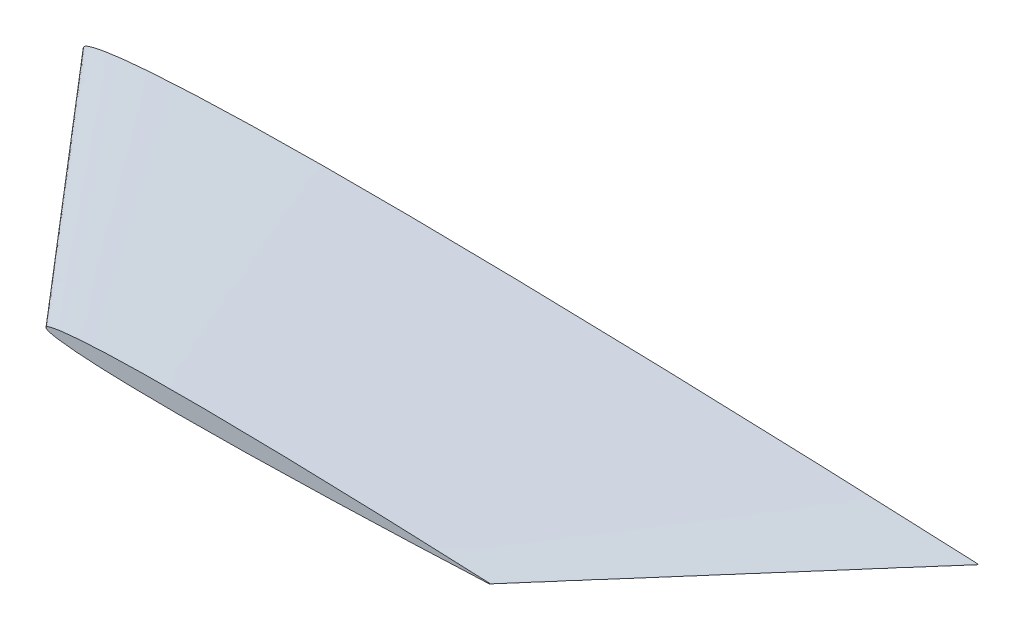
ISO-10303-21;
HEADER;
FILE_DESCRIPTION(('STEP AP214'),'2;1');
FILE_NAME('part.step','',(''),(''),'','','');
FILE_SCHEMA(('AUTOMOTIVE_DESIGN { 1 0 10303 214 1 1 1 1 }'));
ENDSEC;
DATA;
#1=APPLICATION_CONTEXT('core data for automotive mechanical design processes');
#2=APPLICATION_PROTOCOL_DEFINITION('international standard','automotive_design',2000,#1);
#3=PRODUCT_CONTEXT('',#1,'mechanical');
#4=PRODUCT('Part','Part','',(#3));
#5=PRODUCT_RELATED_PRODUCT_CATEGORY('part','',(#4));
#6=PRODUCT_DEFINITION_FORMATION('','',#4);
#7=PRODUCT_DEFINITION_CONTEXT('part definition',#1,'design');
#8=PRODUCT_DEFINITION('design','',#6,#7);
#9=PRODUCT_DEFINITION_SHAPE('','',#8);
#10=(LENGTH_UNIT() NAMED_UNIT(*) SI_UNIT(.MILLI.,.METRE.));
#11=(NAMED_UNIT(*) PLANE_ANGLE_UNIT() SI_UNIT($,.RADIAN.));
#12=(NAMED_UNIT(*) SI_UNIT($,.STERADIAN.) SOLID_ANGLE_UNIT());
#13=UNCERTAINTY_MEASURE_WITH_UNIT(LENGTH_MEASURE(1.E-05),#10,'distance_accuracy_value','');
#14=(GEOMETRIC_REPRESENTATION_CONTEXT(3) GLOBAL_UNCERTAINTY_ASSIGNED_CONTEXT((#13)) GLOBAL_UNIT_ASSIGNED_CONTEXT((#10,
#11,#12)) REPRESENTATION_CONTEXT('',''));
#15=CARTESIAN_POINT('',(0.,0.,0.));
#16=DIRECTION('',(0.,0.,1.));
#17=DIRECTION('',(1.,0.,0.));
#18=AXIS2_PLACEMENT_3D('',#15,#16,#17);
#19=CARTESIAN_POINT('',(38.1,0.,44.45));
#20=DIRECTION('',(0.,0.,-1.));
#21=DIRECTION('',(-1.,0.,0.));
#22=AXIS2_PLACEMENT_3D('',#19,#20,#21);
#23=PLANE('',#22);
#24=CARTESIAN_POINT('',(114.3,0.032004,44.45));
#25=CARTESIAN_POINT('',(114.260858620998,0.0338332497176153,44.45));
#26=CARTESIAN_POINT('',(114.104497045355,0.0411407175529151,44.45));
#27=CARTESIAN_POINT('',(113.753599253628,0.0574913008968349,44.45));
#28=CARTESIAN_POINT('',(113.171158213542,0.0844279205289796,44.45));
#29=CARTESIAN_POINT('',(112.360797120495,0.121322924701901,44.45));
#30=CARTESIAN_POINT('',(111.327484662374,0.167912782142144,44.45));
#31=CARTESIAN_POINT('',(110.077608881608,0.223185391452308,44.45));
#32=CARTESIAN_POINT('',(108.618840268768,0.286264682296366,44.45));
#33=CARTESIAN_POINT('',(106.960228816093,0.35638963247499,44.45));
#34=CARTESIAN_POINT('',(105.111953673685,0.4324276680235,44.45));
#35=CARTESIAN_POINT('',(103.085443407591,0.513296049025075,44.45));
#36=CARTESIAN_POINT('',(100.893176233852,0.598102046191177,44.45));
#37=CARTESIAN_POINT('',(98.5486581279253,0.685605779053373,44.45));
#38=CARTESIAN_POINT('',(96.0663462001016,0.77480839552387,44.45));
#39=CARTESIAN_POINT('',(93.4615563314455,0.86456887935159,44.45));
#40=CARTESIAN_POINT('',(90.7503381760483,0.953630446262733,44.45));
#41=CARTESIAN_POINT('',(87.9494328996523,1.04087755420407,44.45));
#42=CARTESIAN_POINT('',(85.0760650689499,1.12518233639385,44.45));
#43=CARTESIAN_POINT('',(82.1480046930697,1.20491793685094,44.45));
#44=CARTESIAN_POINT('',(79.1832429113206,1.27903579798522,44.45));
#45=CARTESIAN_POINT('',(76.2000905240164,1.34613002806958,44.45));
#46=CARTESIAN_POINT('',(73.2169336760941,1.40465886780372,44.45));
#47=CARTESIAN_POINT('',(70.2521598876147,1.4531293055578,44.45));
#48=CARTESIAN_POINT('',(67.3240847918106,1.4904420900996,44.45));
#49=CARTESIAN_POINT('',(64.4506875387478,1.51522489932473,44.45));
#50=CARTESIAN_POINT('',(61.6497467935834,1.52639263407912,44.45));
#51=CARTESIAN_POINT('',(58.9384822617484,1.52287560954854,44.45));
#52=CARTESIAN_POINT('',(56.3336305105504,1.50417932099381,44.45));
#53=CARTESIAN_POINT('',(53.8512422495764,1.46978286719299,44.45));
#54=CARTESIAN_POINT('',(51.5066276935438,1.41963458816027,44.45));
#55=CARTESIAN_POINT('',(49.314240863919,1.3536757223321,44.45));
#56=CARTESIAN_POINT('',(47.2875762103361,1.2727791572915,44.45));
#57=CARTESIAN_POINT('',(45.4390854476971,1.17741096834271,44.45));
#58=CARTESIAN_POINT('',(43.7801996356398,1.06879581562858,44.45));
#59=CARTESIAN_POINT('',(42.3209398082615,0.947681399576822,44.45));
#60=CARTESIAN_POINT('',(41.07052852673,0.817166233607398,44.45));
#61=CARTESIAN_POINT('',(40.0354498486761,0.674256826868919,44.45));
#62=CARTESIAN_POINT('',(39.2238447200953,0.533283252062589,44.45));
#63=CARTESIAN_POINT('',(38.6317247027826,0.366896924119112,44.45));
#64=CARTESIAN_POINT('',(38.2641821724664,0.242928711156387,44.45));
#65=CARTESIAN_POINT('',(38.0424431788744,0.,44.45));
#66=CARTESIAN_POINT('',(38.2641821724664,-0.242928711156387,44.45));
#67=CARTESIAN_POINT('',(38.6317247027826,-0.366896924119111,44.45));
#68=CARTESIAN_POINT('',(39.2238447200953,-0.533283252062592,44.45));
#69=CARTESIAN_POINT('',(40.0354498486761,-0.674256826868916,44.45));
#70=CARTESIAN_POINT('',(41.0705285267301,-0.8171662336074,44.45));
#71=CARTESIAN_POINT('',(42.3209398082615,-0.947681399576821,44.45));
#72=CARTESIAN_POINT('',(43.7801996356398,-1.06879581562858,44.45));
#73=CARTESIAN_POINT('',(45.4390854476971,-1.17741096834271,44.45));
#74=CARTESIAN_POINT('',(47.2875762103361,-1.2727791572915,44.45));
#75=CARTESIAN_POINT('',(49.314240863919,-1.3536757223321,44.45));
#76=CARTESIAN_POINT('',(51.5066276935438,-1.41963458816027,44.45));
#77=CARTESIAN_POINT('',(53.8512422495764,-1.46978286719299,44.45));
#78=CARTESIAN_POINT('',(56.3336305105503,-1.50417932099381,44.45));
#79=CARTESIAN_POINT('',(58.9384822617484,-1.52287560954854,44.45));
#80=CARTESIAN_POINT('',(61.6497467935834,-1.52639263407912,44.45));
#81=CARTESIAN_POINT('',(64.4506875387478,-1.51522489932473,44.45));
#82=CARTESIAN_POINT('',(67.3240847918106,-1.4904420900996,44.45));
#83=CARTESIAN_POINT('',(70.2521598876147,-1.4531293055578,44.45));
#84=CARTESIAN_POINT('',(73.2169336760941,-1.40465886780372,44.45));
#85=CARTESIAN_POINT('',(76.2000905240164,-1.34613002806958,44.45));
#86=CARTESIAN_POINT('',(79.1832429113206,-1.27903579798522,44.45));
#87=CARTESIAN_POINT('',(82.1480046930697,-1.20491793685094,44.45));
#88=CARTESIAN_POINT('',(85.0760650689498,-1.12518233639386,44.45));
#89=CARTESIAN_POINT('',(87.9494328996523,-1.04087755420407,44.45));
#90=CARTESIAN_POINT('',(90.7503381760482,-0.953630446262733,44.45));
#91=CARTESIAN_POINT('',(93.4615563314454,-0.86456887935159,44.45));
#92=CARTESIAN_POINT('',(96.0663462001016,-0.774808395523871,44.45));
#93=CARTESIAN_POINT('',(98.5486581279253,-0.685605779053373,44.45));
#94=CARTESIAN_POINT('',(100.893176233852,-0.598102046191176,44.45));
#95=CARTESIAN_POINT('',(103.085443407591,-0.513296049025075,44.45));
#96=CARTESIAN_POINT('',(105.111953673685,-0.432427668023501,44.45));
#97=CARTESIAN_POINT('',(106.960228816093,-0.35638963247499,44.45));
#98=CARTESIAN_POINT('',(108.618840268768,-0.286264682296366,44.45));
#99=CARTESIAN_POINT('',(110.077608881608,-0.223185391452307,44.45));
#100=CARTESIAN_POINT('',(111.327484662374,-0.167912782142144,44.45));
#101=CARTESIAN_POINT('',(112.360797120495,-0.121322924701901,44.45));
#102=CARTESIAN_POINT('',(113.171158213542,-0.0844279205289793,44.45));
#103=CARTESIAN_POINT('',(113.753599253628,-0.0574913008968351,44.45));
#104=CARTESIAN_POINT('',(114.104497045355,-0.0411407175529146,44.45));
#105=CARTESIAN_POINT('',(114.260858620998,-0.0338332497176153,44.45));
#106=CARTESIAN_POINT('',(114.3,-0.032004,44.45));
#107=B_SPLINE_CURVE_WITH_KNOTS('',3,(#24,#25,#26,#27,#28,#29,#30,#31,#32,#33,#34,#35,#36,#37,
#38,#39,#40,#41,#42,#43,#44,#45,#46,#47,#48,#49,#50,#51,#52,#53,#54,#55,#56,#57,#58,#59,#60,#61,
#62,#63,#64,#65,#66,#67,#68,#69,#70,#71,#72,#73,#74,#75,#76,#77,#78,#79,#80,#81,#82,#83,#84,#85,
#86,#87,#88,#89,#90,#91,#92,#93,#94,#95,#96,#97,#98,#99,#100,#101,#102,#103,#104,#105,#106),
.UNSPECIFIED.,.F.,.F.,(4,1,1,1,1,1,1,1,1,1,1,1,1,1,1,1,1,1,1,1,1,1,1,1,1,1,1,1,1,1,1,1,1,1,1,1,
1,1,1,1,1,1,1,1,1,1,1,1,1,1,1,1,1,1,1,1,1,1,1,1,1,1,1,1,1,1,1,1,1,1,1,1,1,1,1,1,1,1,1,1,4),(0.,
0.000769075363054967,0.00307229429876435,0.00689462452443817,0.0122129980770875,
0.0189939135438821,0.0271962895135302,0.0367685696679841,0.04765225244644,0.0597793156848744,
0.0730757688774927,0.0874586832594534,0.102839619826908,0.119124190161914,0.136211022881369,
0.15399475628051,0.17236657212777,0.191211673140014,0.21041524145613,0.229857547050433,
0.249419863694867,0.268980998059247,0.288419829497961,0.307617824573225,0.326455527077329,
0.344818578448086,0.362592745666242,0.379669911028139,0.39594558697329,0.41131942363183,
0.425698226139487,0.438994919331845,0.451128209388672,0.462026116437248,0.471623197242087,
0.479864509226328,0.486704184732881,0.492110985593961,0.496072413913456,0.498623118658728,0.5,
0.501376881341272,0.503927586086544,0.507889014406039,0.513295815267119,0.520135490773672,
0.528376802757913,0.537973883562752,0.548871790611328,0.561005080668155,0.574301773860513,
0.58868057636817,0.60405441302671,0.620330088971861,0.637407254333758,0.655181421551914,
0.673544472922671,0.692382175426775,0.711580170502039,0.731019001940753,0.750580136305133,
0.770142452949567,0.78958475854387,0.808788326859986,0.82763342787223,0.84600524371949,
0.863788977118631,0.880875809838086,0.897160380173092,0.912541316740547,0.926924231122507,
0.940220684315126,0.95234774755356,0.963231430332016,0.97280371048647,0.981006086456118,
0.987787001922912,0.993105375475562,0.996927705701236,0.999230924636945,1.),.UNSPECIFIED.);
#108=CARTESIAN_POINT('',(113.623373572006,0.0635000000000053,44.45));
#109=VERTEX_POINT('',#108);
#110=CARTESIAN_POINT('',(113.623373572006,-0.0634999999999947,44.45));
#111=VERTEX_POINT('',#110);
#112=EDGE_CURVE('E84',#109,#111,#107,.T.);
#113=ORIENTED_EDGE('',*,*,#112,.T.);
#114=CARTESIAN_POINT('',(113.620433513998,0.,44.45));
#115=DIRECTION('',(0.,0.,1.));
#116=DIRECTION('',(-1.,0.,0.));
#117=AXIS2_PLACEMENT_3D('',#114,#115,#116);
#118=CIRCLE('',#117,0.0635680260908786);
#119=EDGE_CURVE('E12',#111,#109,#118,.T.);
#120=ORIENTED_EDGE('',*,*,#119,.T.);
#121=EDGE_LOOP('',(#113,#120));
#122=FACE_BOUND('',#121,.T.);
#123=ADVANCED_FACE('F74',(#122),#23,.F.);
#124=CARTESIAN_POINT('',(0.,0.,0.));
#125=DIRECTION('',(0.,0.,-1.));
#126=DIRECTION('',(-1.,0.,0.));
#127=AXIS2_PLACEMENT_3D('',#124,#125,#126);
#128=PLANE('',#127);
#129=CARTESIAN_POINT('',(152.4,0.064008,0.));
#130=CARTESIAN_POINT('',(152.321717241995,0.0676664994352305,0.));
#131=CARTESIAN_POINT('',(151.619926170392,0.100464299417515,0.));
#132=CARTESIAN_POINT('',(150.376769843603,0.15818139005698,0.));
#133=CARTESIAN_POINT('',(148.52159424099,0.242645849403799,0.));
#134=CARTESIAN_POINT('',(146.454969324747,0.33582556428429,0.));
#135=CARTESIAN_POINT('',(143.955217763217,0.446370782904614,0.));
#136=CARTESIAN_POINT('',(141.037680537536,0.572529364592733,0.));
#137=CARTESIAN_POINT('',(137.720457632186,0.712779264949982,0.));
#138=CARTESIAN_POINT('',(134.02390734737,0.864855336046998,0.));
#139=CARTESIAN_POINT('',(129.970886815183,1.02659209805015,0.));
#140=CARTESIAN_POINT('',(125.586352467704,1.19620409238235,0.));
#141=CARTESIAN_POINT('',(120.897316255851,1.37121155810675,0.));
#142=CARTESIAN_POINT('',(115.932692400203,1.54961679104774,0.));
#143=CARTESIAN_POINT('',(110.723112662891,1.72913775870318,0.));
#144=CARTESIAN_POINT('',(105.300676352096,1.90726089252547,0.));
#145=CARTESIAN_POINT('',(99.6988657993046,2.08175510840814,0.));
#146=CARTESIAN_POINT('',(93.9521301378997,2.25036467278771,0.));
#147=CARTESIAN_POINT('',(88.0960093861395,2.40983587370188,0.));
#148=CARTESIAN_POINT('',(82.1664858226412,2.55807159597043,0.));
#149=CARTESIAN_POINT('',(76.2001810480328,2.69226005613916,0.));
#150=CARTESIAN_POINT('',(70.2338673521882,2.80931773560744,0.));
#151=CARTESIAN_POINT('',(64.3043197752294,2.9062586111156,0.));
#152=CARTESIAN_POINT('',(58.4481695836212,2.9808841801992,0.));
#153=CARTESIAN_POINT('',(52.7013750774956,3.03044979864946,0.));
#154=CARTESIAN_POINT('',(47.0994935871668,3.05278526815824,0.));
#155=CARTESIAN_POINT('',(41.6769645234968,3.04575121909708,0.));
#156=CARTESIAN_POINT('',(36.4672610211007,3.00835864198762,0.));
#157=CARTESIAN_POINT('',(31.5024844991528,2.93956573438597,0.));
#158=CARTESIAN_POINT('',(26.8132553870877,2.83926917632055,0.));
#159=CARTESIAN_POINT('',(22.428481727838,2.70735144466421,0.));
#160=CARTESIAN_POINT('',(18.3751524206722,2.54555831458299,0.));
#161=CARTESIAN_POINT('',(14.6781708953942,2.35482193668541,0.));
#162=CARTESIAN_POINT('',(11.3603992712795,2.13759163125717,0.));
#163=CARTESIAN_POINT('',(8.44187961652294,1.89536279915365,0.));
#164=CARTESIAN_POINT('',(5.94105705346007,1.63433246721479,0.));
#165=CARTESIAN_POINT('',(3.87089969735216,1.34851365373784,0.));
#166=CARTESIAN_POINT('',(2.24768944019057,1.06656650412517,0.));
#167=CARTESIAN_POINT('',(1.06344940556516,0.733793848238233,0.));
#168=CARTESIAN_POINT('',(0.328364344932801,0.485857422312756,0.));
#169=CARTESIAN_POINT('',(-0.115113642251177,0.,0.));
#170=CARTESIAN_POINT('',(0.328364344932823,-0.485857422312801,0.));
#171=CARTESIAN_POINT('',(1.06344940556516,-0.733793848238214,0.));
#172=CARTESIAN_POINT('',(2.24768944019056,-1.06656650412518,0.));
#173=CARTESIAN_POINT('',(3.87089969735215,-1.34851365373784,0.));
#174=CARTESIAN_POINT('',(5.94105705346006,-1.63433246721479,0.));
#175=CARTESIAN_POINT('',(8.44187961652293,-1.89536279915364,0.));
#176=CARTESIAN_POINT('',(11.3603992712796,-2.13759163125717,0.));
#177=CARTESIAN_POINT('',(14.6781708953942,-2.35482193668541,0.));
#178=CARTESIAN_POINT('',(18.3751524206723,-2.54555831458299,0.));
#179=CARTESIAN_POINT('',(22.428481727838,-2.70735144466421,0.));
#180=CARTESIAN_POINT('',(26.8132553870877,-2.83926917632054,0.));
#181=CARTESIAN_POINT('',(31.5024844991527,-2.93956573438597,0.));
#182=CARTESIAN_POINT('',(36.4672610211008,-3.00835864198762,0.));
#183=CARTESIAN_POINT('',(41.6769645234967,-3.04575121909708,0.));
#184=CARTESIAN_POINT('',(47.0994935871668,-3.05278526815824,0.));
#185=CARTESIAN_POINT('',(52.7013750774956,-3.03044979864946,0.));
#186=CARTESIAN_POINT('',(58.4481695836212,-2.9808841801992,0.));
#187=CARTESIAN_POINT('',(64.3043197752294,-2.90625861111561,0.));
#188=CARTESIAN_POINT('',(70.2338673521882,-2.80931773560744,0.));
#189=CARTESIAN_POINT('',(76.2001810480328,-2.69226005613916,0.));
#190=CARTESIAN_POINT('',(82.1664858226413,-2.55807159597043,0.));
#191=CARTESIAN_POINT('',(88.0960093861394,-2.40983587370188,0.));
#192=CARTESIAN_POINT('',(93.9521301378997,-2.25036467278771,0.));
#193=CARTESIAN_POINT('',(99.6988657993046,-2.08175510840814,0.));
#194=CARTESIAN_POINT('',(105.300676352097,-1.90726089252547,0.));
#195=CARTESIAN_POINT('',(110.723112662891,-1.72913775870318,0.));
#196=CARTESIAN_POINT('',(115.932692400203,-1.54961679104774,0.));
#197=CARTESIAN_POINT('',(120.897316255851,-1.37121155810675,0.));
#198=CARTESIAN_POINT('',(125.586352467704,-1.19620409238235,0.));
#199=CARTESIAN_POINT('',(129.970886815183,-1.02659209805015,0.));
#200=CARTESIAN_POINT('',(134.02390734737,-0.864855336046998,0.));
#201=CARTESIAN_POINT('',(137.720457632186,-0.712779264949981,0.));
#202=CARTESIAN_POINT('',(141.037680537536,-0.572529364592734,0.));
#203=CARTESIAN_POINT('',(143.955217763217,-0.446370782904613,0.));
#204=CARTESIAN_POINT('',(146.454969324747,-0.335825564284289,0.));
#205=CARTESIAN_POINT('',(148.52159424099,-0.242645849403801,0.));
#206=CARTESIAN_POINT('',(150.376769843603,-0.158181390056979,0.));
#207=CARTESIAN_POINT('',(151.619926170392,-0.100464299417515,0.));
#208=CARTESIAN_POINT('',(152.321717241995,-0.0676664994352305,0.));
#209=CARTESIAN_POINT('',(152.4,-0.064008,0.));
#210=B_SPLINE_CURVE_WITH_KNOTS('',3,(#129,#130,#131,#132,#133,#134,#135,#136,#137,#138,#139,
#140,#141,#142,#143,#144,#145,#146,#147,#148,#149,#150,#151,#152,#153,#154,#155,#156,#157,#158,
#159,#160,#161,#162,#163,#164,#165,#166,#167,#168,#169,#170,#171,#172,#173,#174,#175,#176,#177,
#178,#179,#180,#181,#182,#183,#184,#185,#186,#187,#188,#189,#190,#191,#192,#193,#194,#195,#196,
#197,#198,#199,#200,#201,#202,#203,#204,#205,#206,#207,#208,#209),.UNSPECIFIED.,.F.,.F.,(4,1,1,
1,1,1,1,1,1,1,1,1,1,1,1,1,1,1,1,1,1,1,1,1,1,1,1,1,1,1,1,1,1,1,1,1,1,1,1,1,1,1,1,1,1,1,1,1,1,1,1,
1,1,1,1,1,1,1,1,1,1,1,1,1,1,1,1,1,1,1,1,1,1,1,1,1,1,1,4),(0.,0.000769075363055058,
0.00689462452443808,0.0122129980770876,0.0189939135438821,0.0271962895135302,0.036768569667984,
0.0476522524464399,0.0597793156848744,0.0730757688774928,0.0874586832594534,0.102839619826908,
0.119124190161914,0.136211022881369,0.15399475628051,0.17236657212777,0.191211673140014,
0.21041524145613,0.229857547050433,0.249419863694867,0.268980998059247,0.288419829497961,
0.307617824573225,0.326455527077329,0.344818578448086,0.362592745666242,0.379669911028139,
0.39594558697329,0.41131942363183,0.425698226139487,0.438994919331845,0.451128209388672,
0.462026116437248,0.471623197242087,0.479864509226328,0.486704184732881,0.492110985593961,
0.496072413913456,0.498623118658728,0.5,0.501376881341272,0.503927586086544,0.507889014406039,
0.51329581526712,0.520135490773673,0.528376802757914,0.537973883562752,0.548871790611328,
0.561005080668155,0.574301773860513,0.58868057636817,0.60405441302671,0.620330088971861,
0.637407254333759,0.655181421551914,0.673544472922671,0.692382175426775,0.711580170502039,
0.731019001940754,0.750580136305134,0.770142452949568,0.78958475854387,0.808788326859986,
0.827633427872231,0.846005243719491,0.863788977118631,0.880875809838086,0.897160380173093,
0.912541316740547,0.926924231122508,0.940220684315126,0.95234774755356,0.963231430332016,
0.97280371048647,0.981006086456118,0.987787001922913,0.993105375475562,0.999230924636945,1.),.UNSPECIFIED.);
#211=CARTESIAN_POINT('',(152.4,0.064008,0.));
#212=VERTEX_POINT('',#211);
#213=CARTESIAN_POINT('',(152.4,-0.064008,0.));
#214=VERTEX_POINT('',#213);
#215=EDGE_CURVE('E106',#212,#214,#210,.T.);
#216=ORIENTED_EDGE('',*,*,#215,.F.);
#217=CARTESIAN_POINT('',(152.397008623127,0.,0.));
#218=DIRECTION('',(0.,0.,1.));
#219=DIRECTION('',(-1.,0.,0.));
#220=AXIS2_PLACEMENT_3D('',#217,#218,#219);
#221=CIRCLE('',#220,0.0640778620086238);
#222=EDGE_CURVE('E102',#214,#212,#221,.T.);
#223=ORIENTED_EDGE('',*,*,#222,.F.);
#224=EDGE_LOOP('',(#216,#223));
#225=FACE_BOUND('',#224,.T.);
#226=ADVANCED_FACE('F113',(#225),#128,.T.);
#227=CARTESIAN_POINT('',(152.400000032462,0.0640079984829036,0.));
#228=CARTESIAN_POINT('',(113.623373598462,0.063499998775084,44.45));
#229=CARTESIAN_POINT('',(149.219739362269,0.212635642197861,0.));
#230=CARTESIAN_POINT('',(112.046294704379,0.136518950457792,44.45));
#231=CARTESIAN_POINT('',(142.858522905096,0.498805334055691,0.));
#232=CARTESIAN_POINT('',(108.891969604815,0.276710780788115,44.45));
#233=CARTESIAN_POINT('',(133.314815721889,0.897308068033781,0.));
#234=CARTESIAN_POINT('',(104.160125744892,0.472611082577036,44.45));
#235=CARTESIAN_POINT('',(123.769499069923,1.26810653938784,0.));
#236=CARTESIAN_POINT('',(99.4279836536854,0.654734517515544,44.45));
#237=CARTESIAN_POINT('',(114.222725182215,1.61254251986529,0.));
#238=CARTESIAN_POINT('',(94.6955977446699,0.824100340021906,44.45));
#239=CARTESIAN_POINT('',(106.265955496673,1.87743474068318,0.));
#240=CARTESIAN_POINT('',(90.7517387940618,0.954128983081627,44.4500000000001));
#241=CARTESIAN_POINT('',(99.899889701662,2.07514700661706,0.));
#242=CARTESIAN_POINT('',(87.5965321893642,1.05128103789345,44.45));
#243=CARTESIAN_POINT('',(95.1250294046511,2.21626219975023,0.));
#244=CARTESIAN_POINT('',(85.230063049237,1.12044603978766,44.4499999999999));
#245=CARTESIAN_POINT('',(90.3498452303202,2.34923984764112,0.));
#246=CARTESIAN_POINT('',(82.8635252580072,1.18564839307052,44.45));
#247=CARTESIAN_POINT('',(85.5743480562345,2.47375883180392,0.));
#248=CARTESIAN_POINT('',(80.4969173715982,1.24663142503318,44.4500000000001));
#249=CARTESIAN_POINT('',(80.7985445265386,2.58931623493336,0.));
#250=CARTESIAN_POINT('',(78.1302379459328,1.3031384629668,44.4499999999999));
#251=CARTESIAN_POINT('',(76.0224346104729,2.69496226496405,0.));
#252=CARTESIAN_POINT('',(75.7634836865657,1.35471576878711,44.45));
#253=CARTESIAN_POINT('',(71.2460224393302,2.78963583346212,0.));
#254=CARTESIAN_POINT('',(73.3966510847476,1.40080308482749,44.45));
#255=CARTESIAN_POINT('',(66.4693145452758,2.87202045327804,0.));
#256=CARTESIAN_POINT('',(71.029740447409,1.4407804374235,44.45));
#257=CARTESIAN_POINT('',(61.6923315797195,2.94105554115991,0.));
#258=CARTESIAN_POINT('',(68.6627576711968,1.47412759533569,44.45));
#259=CARTESIAN_POINT('',(56.9150974046164,2.99524042286684,0.));
#260=CARTESIAN_POINT('',(66.295710302023,1.50007013231191,44.45));
#261=CARTESIAN_POINT('',(52.13764679216,3.03263021302315,0.));
#262=CARTESIAN_POINT('',(63.9286119540016,1.51766469287254,44.45));
#263=CARTESIAN_POINT('',(48.1563028933342,3.04806046437577,0.));
#264=CARTESIAN_POINT('',(61.9560065872858,1.5245013266666,44.45));
#265=CARTESIAN_POINT('',(44.9711863499906,3.0495692917529,0.));
#266=CARTESIAN_POINT('',(60.3779262712243,1.52458449999912,44.45));
#267=CARTESIAN_POINT('',(42.5823428152765,3.04492230714381,0.));
#268=CARTESIAN_POINT('',(59.1943747896466,1.5217794474796,44.45));
#269=CARTESIAN_POINT('',(40.1935084240572,3.03414139139765,0.));
#270=CARTESIAN_POINT('',(58.0108388303503,1.51593259677361,44.45));
#271=CARTESIAN_POINT('',(37.8047033568314,3.0167507101691,0.));
#272=CARTESIAN_POINT('',(56.8273288079289,1.50679463624522,44.45));
#273=CARTESIAN_POINT('',(35.4159514199922,2.99221490164496,0.));
#274=CARTESIAN_POINT('',(55.643855136976,1.49411625425845,44.45));
#275=CARTESIAN_POINT('',(33.0272828820662,2.95993236991127,0.));
#276=CARTESIAN_POINT('',(54.4604333251997,1.47758395911883,44.4500000000001));
#277=CARTESIAN_POINT('',(30.6387340348799,2.91924713883976,0.));
#278=CARTESIAN_POINT('',(53.27708026002,1.45689046661999,44.4499999999999));
#279=CARTESIAN_POINT('',(28.2503515276416,2.86936955510442,0.));
#280=CARTESIAN_POINT('',(52.0938194266254,1.43162138883368,44.45));
#281=CARTESIAN_POINT('',(25.8621962930913,2.80926447430132,0.));
#282=CARTESIAN_POINT('',(50.9106803101033,1.40128129800328,44.45));
#283=CARTESIAN_POINT('',(23.4743465379744,2.73781029889517,0.));
#284=CARTESIAN_POINT('',(49.7277018242786,1.36530119392278,44.4500000000001));
#285=CARTESIAN_POINT('',(21.484806343191,2.66778477708081,0.));
#286=CARTESIAN_POINT('',(48.7420590991842,1.33013633558956,44.45));
#287=CARTESIAN_POINT('',(19.8934426593247,2.60464195587471,0.));
#288=CARTESIAN_POINT('',(47.9536830867177,1.29844474899248,44.45));
#289=CARTESIAN_POINT('',(18.7000804074988,2.55336849609407,0.));
#290=CARTESIAN_POINT('',(47.3624825080885,1.27274987098352,44.45));
#291=CARTESIAN_POINT('',(17.5069018852351,2.49795409865328,0.));
#292=CARTESIAN_POINT('',(46.7713757070961,1.24498246681755,44.45));
#293=CARTESIAN_POINT('',(16.3139410580456,2.43800617821064,0.));
#294=CARTESIAN_POINT('',(46.1803791595082,1.21497185965713,44.4499999999999));
#295=CARTESIAN_POINT('',(15.121239421486,2.37307871673533,0.));
#296=CARTESIAN_POINT('',(45.5895136683359,1.18248378623925,44.4500000000001));
#297=CARTESIAN_POINT('',(13.9288407227108,2.30278578187097,0.));
#298=CARTESIAN_POINT('',(44.9988005887138,1.1473401878205,44.4499999999999));
#299=CARTESIAN_POINT('',(12.7368076353965,2.22650897184023,0.));
#300=CARTESIAN_POINT('',(44.4082723364349,1.10921079003622,44.45));
#301=CARTESIAN_POINT('',(11.5452351581385,2.14332461090895,0.));
#302=CARTESIAN_POINT('',(43.817975876994,1.06764865549651,44.45));
#303=CARTESIAN_POINT('',(10.3542167136949,2.05251467864724,0.));
#304=CARTESIAN_POINT('',(43.2279566541402,1.02231059658556,44.45));
#305=CARTESIAN_POINT('',(9.1639061593473,1.95282797884363,0.));
#306=CARTESIAN_POINT('',(42.6382940911003,0.972541428500923,44.45));
#307=CARTESIAN_POINT('',(8.17271200743928,1.86140204517477,0.));
#308=CARTESIAN_POINT('',(42.1472713803885,0.92696320663569,44.45));
#309=CARTESIAN_POINT('',(7.38033053622929,1.78233982306767,0.));
#310=CARTESIAN_POINT('',(41.7547451999246,0.887498367291132,44.45));
#311=CARTESIAN_POINT('',(6.78642306078383,1.71935008533761,0.));
#312=CARTESIAN_POINT('',(41.4605389072273,0.856092993329944,44.45));
#313=CARTESIAN_POINT('',(6.19297036594793,1.65220964504095,0.));
#314=CARTESIAN_POINT('',(41.1665633057786,0.822575261389406,44.45));
#315=CARTESIAN_POINT('',(5.60007079343382,1.58032580550321,0.));
#316=CARTESIAN_POINT('',(40.8728639529241,0.786734203790879,44.45));
#317=CARTESIAN_POINT('',(5.0078357281093,1.50316654656606,0.));
#318=CARTESIAN_POINT('',(40.5794931341256,0.748266166837936,44.45));
#319=CARTESIAN_POINT('',(4.41634815554123,1.42044244498965,0.));
#320=CARTESIAN_POINT('',(40.286499936675,0.707059616150722,44.45));
#321=CARTESIAN_POINT('',(3.82576646258758,1.33150256002025,0.));
#322=CARTESIAN_POINT('',(39.9939431625033,0.662784537513147,44.45));
#323=CARTESIAN_POINT('',(3.23612429159674,1.23648096891248,0.));
#324=CARTESIAN_POINT('',(39.7018789378486,0.615491823456866,44.45));
#325=CARTESIAN_POINT('',(2.74644936202503,1.14724786916906,0.));
#326=CARTESIAN_POINT('',(39.4593338833073,0.5708915491443,44.45));
#327=CARTESIAN_POINT('',(2.35657648629369,1.06633863952074,0.));
#328=CARTESIAN_POINT('',(39.2662638612851,0.530558109746768,44.45));
#329=CARTESIAN_POINT('',(2.06536647436785,1.00019906647837,0.));
#330=CARTESIAN_POINT('',(39.1220516644221,0.497578694778835,44.45));
#331=CARTESIAN_POINT('',(1.77562172072916,0.927831468536679,0.));
#332=CARTESIAN_POINT('',(38.9785370960609,0.461467218945071,44.45));
#333=CARTESIAN_POINT('',(1.48730281548766,0.850119728965415,0.));
#334=CARTESIAN_POINT('',(38.8357493837817,0.422738610890488,44.45));
#335=CARTESIAN_POINT('',(1.20042523697552,0.76701656149871,0.));
#336=CARTESIAN_POINT('',(38.6937177551649,0.381907799260097,44.4500000000001));
#337=CARTESIAN_POINT('',(0.914937053809609,0.679721564036522,0.));
#338=CARTESIAN_POINT('',(38.5521428802222,0.337419064923658,44.4499999999999));
#339=CARTESIAN_POINT('',(0.678344013033462,0.60187804572962,0.));
#340=CARTESIAN_POINT('',(38.4352866982323,0.300635142554084,44.4500000000001));
#341=CARTESIAN_POINT('',(0.496546881571234,0.520206370438059,0.));
#342=CARTESIAN_POINT('',(38.3451472789853,0.257772143606717,44.45));
#343=CARTESIAN_POINT('',(0.366262998985252,0.44679050238048,0.));
#344=CARTESIAN_POINT('',(38.2806568418705,0.2206601506696,44.45));
#345=CARTESIAN_POINT('',(0.244361452644739,0.360577862642875,0.));
#346=CARTESIAN_POINT('',(38.2207218962241,0.180336600805161,44.45));
#347=CARTESIAN_POINT('',(0.132232669999098,0.260810819023391,0.));
#348=CARTESIAN_POINT('',(38.1657914731647,0.131588695499455,44.45));
#349=CARTESIAN_POINT('',(0.0364234123327542,0.147016960110075,0.));
#350=CARTESIAN_POINT('',(38.1163146038107,0.0692036362385399,44.45));
#351=CARTESIAN_POINT('',(-0.0182140588246021,9.1622377558693E-08,0.));
#352=CARTESIAN_POINT('',(38.0929395575602,0.,44.45));
#353=CARTESIAN_POINT('',(0.0364233099864555,-0.147016814683769,0.));
#354=CARTESIAN_POINT('',(38.1163146038107,-0.0692036362385019,44.45));
#355=CARTESIAN_POINT('',(0.132232552518735,-0.260810697492869,0.));
#356=CARTESIAN_POINT('',(38.1657914731647,-0.131588695499424,44.45));
#357=CARTESIAN_POINT('',(0.244361316300302,-0.360577756491663,0.));
#358=CARTESIAN_POINT('',(38.2207218962241,-0.180336600805134,44.45));
#359=CARTESIAN_POINT('',(0.366262855185947,-0.446790410797338,0.));
#360=CARTESIAN_POINT('',(38.2806568418705,-0.220660150669583,44.45));
#361=CARTESIAN_POINT('',(0.496546728040901,-0.520206293601319,0.));
#362=CARTESIAN_POINT('',(38.3451472789852,-0.257772143606702,44.45));
#363=CARTESIAN_POINT('',(0.678343852615799,-0.601877986478297,0.));
#364=CARTESIAN_POINT('',(38.4352866982322,-0.300635142554076,44.45));
#365=CARTESIAN_POINT('',(0.914936890085519,-0.679721514206,0.));
#366=CARTESIAN_POINT('',(38.5521428802222,-0.337419064923659,44.45));
#367=CARTESIAN_POINT('',(1.2004250733885,-0.767016511900975,0.));
#368=CARTESIAN_POINT('',(38.6937177551648,-0.381907799260085,44.45));
#369=CARTESIAN_POINT('',(1.4873026506424,-0.850119683275416,0.));
#370=CARTESIAN_POINT('',(38.8357493837817,-0.422738610890482,44.45));
#371=CARTESIAN_POINT('',(1.77562155529641,-0.927831425307033,0.));
#372=CARTESIAN_POINT('',(38.9785370960609,-0.461467218945068,44.45));
#373=CARTESIAN_POINT('',(2.06536630797811,-1.0001990268899,0.));
#374=CARTESIAN_POINT('',(39.1220516644221,-0.497578694778831,44.45));
#375=CARTESIAN_POINT('',(2.35657631916978,-1.0663386032846,0.));
#376=CARTESIAN_POINT('',(39.2662638612851,-0.530558109746765,44.45));
#377=CARTESIAN_POINT('',(2.74644919408563,-1.14724783681088,0.));
#378=CARTESIAN_POINT('',(39.4593338833073,-0.570891549144297,44.45));
#379=CARTESIAN_POINT('',(3.23612412298066,-1.23648094038261,0.));
#380=CARTESIAN_POINT('',(39.7018789378487,-0.615491823456867,44.45));
#381=CARTESIAN_POINT('',(3.8257662936043,-1.33150253377684,0.));
#382=CARTESIAN_POINT('',(39.9939431625033,-0.662784537513142,44.4500000000001));
#383=CARTESIAN_POINT('',(4.41634798631228,-1.42044242039288,0.));
#384=CARTESIAN_POINT('',(40.286499936675,-0.707059616150729,44.4499999999999));
#385=CARTESIAN_POINT('',(5.00783555863423,-1.50316652371826,0.));
#386=CARTESIAN_POINT('',(40.5794931341256,-0.748266166837937,44.4500000000002));
#387=CARTESIAN_POINT('',(5.6000706237627,-1.58032578417273,0.));
#388=CARTESIAN_POINT('',(40.8728639529241,-0.786734203790877,44.4499999999999));
#389=CARTESIAN_POINT('',(6.19297019609897,-1.65220962517255,0.));
#390=CARTESIAN_POINT('',(41.1665633057786,-0.822575261389408,44.4500000000001));
#391=CARTESIAN_POINT('',(6.78642289079329,-1.71935006672899,0.));
#392=CARTESIAN_POINT('',(41.4605389072273,-0.856092993329945,44.4499999999999));
#393=CARTESIAN_POINT('',(7.38033036611859,-1.78233980559126,0.));
#394=CARTESIAN_POINT('',(41.7547451999246,-0.887498367291131,44.4499999999999));
#395=CARTESIAN_POINT('',(8.17271183720337,-1.86140202895917,0.));
#396=CARTESIAN_POINT('',(42.1472713803885,-0.926963206635689,44.4500000000001));
#397=CARTESIAN_POINT('',(9.16390598899759,-1.95282796386656,0.));
#398=CARTESIAN_POINT('',(42.6382940911003,-0.972541428500924,44.45));
#399=CARTESIAN_POINT('',(10.3542165432297,-2.05251466505206,0.));
#400=CARTESIAN_POINT('',(43.2279566541403,-1.02231059658556,44.45));
#401=CARTESIAN_POINT('',(11.5452349875854,-2.14332459847105,0.));
#402=CARTESIAN_POINT('',(43.817975876994,-1.06764865549651,44.45));
#403=CARTESIAN_POINT('',(12.7368074647707,-2.22650896044617,0.));
#404=CARTESIAN_POINT('',(44.4082723364349,-1.10921079003621,44.45));
#405=CARTESIAN_POINT('',(13.9288405520261,-2.30278577140028,0.));
#406=CARTESIAN_POINT('',(44.9988005887139,-1.14734018782051,44.45));
#407=CARTESIAN_POINT('',(15.1212392507542,-2.37307870706495,0.));
#408=CARTESIAN_POINT('',(45.5895136683358,-1.18248378623925,44.45));
#409=CARTESIAN_POINT('',(16.3139408872735,-2.43800616928215,0.));
#410=CARTESIAN_POINT('',(46.1803791595082,-1.21497185965713,44.45));
#411=CARTESIAN_POINT('',(17.5069017144288,-2.49795409040592,0.));
#412=CARTESIAN_POINT('',(46.7713757070961,-1.24498246681755,44.45));
#413=CARTESIAN_POINT('',(18.7000802366638,-2.55336848846443,0.));
#414=CARTESIAN_POINT('',(47.3624825080885,-1.27274987098352,44.45));
#415=CARTESIAN_POINT('',(19.8934424884651,-2.60464194882,0.));
#416=CARTESIAN_POINT('',(47.9536830867177,-1.29844474899248,44.45));
#417=CARTESIAN_POINT('',(21.484806172303,-2.66778477074381,0.));
#418=CARTESIAN_POINT('',(48.7420590991841,-1.33013633558957,44.4499999999999));
#419=CARTESIAN_POINT('',(23.4743463670587,-2.73781029334068,0.));
#420=CARTESIAN_POINT('',(49.7277018242788,-1.36530119392278,44.4500000000001));
#421=CARTESIAN_POINT('',(25.8621961221505,-2.80926446961245,0.));
#422=CARTESIAN_POINT('',(50.9106803101032,-1.40128129800328,44.4499999999999));
#423=CARTESIAN_POINT('',(28.2503513566808,-2.8693695511725,0.));
#424=CARTESIAN_POINT('',(52.0938194266255,-1.43162138883368,44.4500000000001));
#425=CARTESIAN_POINT('',(30.638733863906,-2.91924713562338,0.));
#426=CARTESIAN_POINT('',(53.27708026002,-1.45689046661999,44.4499999999999));
#427=CARTESIAN_POINT('',(33.0272827110791,-2.95993236728359,0.));
#428=CARTESIAN_POINT('',(54.4604333251998,-1.47758395911883,44.4500000000001));
#429=CARTESIAN_POINT('',(35.4159512490023,-2.99221489966236,0.));
#430=CARTESIAN_POINT('',(55.643855136976,-1.49411625425845,44.4499999999999));
#431=CARTESIAN_POINT('',(37.8047031858268,-3.01675070859554,0.));
#432=CARTESIAN_POINT('',(56.8273288079289,-1.50679463624522,44.45));
#433=CARTESIAN_POINT('',(40.1935082530663,-3.03414139054243,0.));
#434=CARTESIAN_POINT('',(58.0108388303504,-1.51593259677361,44.45));
#435=CARTESIAN_POINT('',(42.5823426442518,-3.04492230632773,0.));
#436=CARTESIAN_POINT('',(59.1943747896467,-1.52177944747959,44.45));
#437=CARTESIAN_POINT('',(44.9711861790211,-3.04956929209537,0.));
#438=CARTESIAN_POINT('',(60.3779262712244,-1.52458449999912,44.45));
#439=CARTESIAN_POINT('',(48.1563027222588,-3.04806046386082,0.));
#440=CARTESIAN_POINT('',(61.9560065872859,-1.52450132666661,44.45));
#441=CARTESIAN_POINT('',(52.1376466212955,-3.03263021584404,0.));
#442=CARTESIAN_POINT('',(63.9286119540017,-1.51766469287254,44.4499999999999));
#443=CARTESIAN_POINT('',(56.9150972333595,-2.99524042111246,0.));
#444=CARTESIAN_POINT('',(66.2957103020231,-1.50007013231192,44.4500000000001));
#445=CARTESIAN_POINT('',(61.6923314091937,-2.94105554946788,0.));
#446=CARTESIAN_POINT('',(68.6627576711968,-1.47412759533569,44.4499999999999));
#447=CARTESIAN_POINT('',(66.4693143735129,-2.87202044578327,0.));
#448=CARTESIAN_POINT('',(71.029740447409,-1.4407804374235,44.4500000000001));
#449=CARTESIAN_POINT('',(71.2460222700905,-2.7896358593771,0.));
#450=CARTESIAN_POINT('',(73.3966510847476,-1.40080308482749,44.45));
#451=CARTESIAN_POINT('',(76.0224344359222,-2.69496222161384,0.));
#452=CARTESIAN_POINT('',(75.7634836865656,-1.35471576878711,44.45));
#453=CARTESIAN_POINT('',(80.7985443652417,-2.58931636546434,0.));
#454=CARTESIAN_POINT('',(78.130237945933,-1.3031384629668,44.45));
#455=CARTESIAN_POINT('',(85.5743478699901,-2.47375863576964,0.));
#456=CARTESIAN_POINT('',(80.496917371598,-1.24663142503318,44.45));
#457=CARTESIAN_POINT('',(90.3498450862742,-2.34924020457781,0.));
#458=CARTESIAN_POINT('',(82.8635252580072,-1.18564839307052,44.45));
#459=CARTESIAN_POINT('',(95.1250291854505,-2.21626157241035,0.));
#460=CARTESIAN_POINT('',(85.2300630492372,-1.12044603978766,44.4500000000001));
#461=CARTESIAN_POINT('',(99.8998896112773,-2.07514806685954,0.));
#462=CARTESIAN_POINT('',(87.5965321893643,-1.05128103789345,44.45));
#463=CARTESIAN_POINT('',(106.265955157909,-1.87743254725331,0.));
#464=CARTESIAN_POINT('',(90.7517387940617,-0.954128983081627,44.4499999999999));
#465=CARTESIAN_POINT('',(114.222725501347,-1.61254894888659,0.));
#466=CARTESIAN_POINT('',(94.6955977446701,-0.824100340021903,44.4500000000001));
#467=CARTESIAN_POINT('',(123.769498123584,-1.26809636393484,0.));
#468=CARTESIAN_POINT('',(99.4279836536853,-0.654734517515547,44.4499999999999));
#469=CARTESIAN_POINT('',(133.314816699704,-0.897323242222112,0.));
#470=CARTESIAN_POINT('',(104.160125744892,-0.472611082577036,44.4500000000001));
#471=CARTESIAN_POINT('',(142.858520566566,-0.498776048104569,0.));
#472=CARTESIAN_POINT('',(108.891969604815,-0.276710780788118,44.45));
#473=CARTESIAN_POINT('',(149.219739362269,-0.212635642197913,0.));
#474=CARTESIAN_POINT('',(112.046294704379,-0.136518950457793,44.45));
#475=CARTESIAN_POINT('',(152.42439763972,-0.0628677904134742,0.));
#476=CARTESIAN_POINT('',(113.635472276986,-0.0629398284336154,44.45));
#477=CARTESIAN_POINT('',(152.451067604741,-0.0412484071312703,0.));
#478=CARTESIAN_POINT('',(113.663813622054,-0.0560576850927141,44.4499999999999));
#479=CARTESIAN_POINT('',(152.466398188987,0.,0.));
#480=CARTESIAN_POINT('',(113.69434303989,0.000328926967690386,44.45));
#481=CARTESIAN_POINT('',(152.451067604742,0.0412484071312828,0.));
#482=CARTESIAN_POINT('',(113.663867066137,0.0559566220278086,44.45));
#483=CARTESIAN_POINT('',(152.42439763972,0.0628677904134742,0.));
#484=CARTESIAN_POINT('',(113.635472276986,0.0629398284336261,44.45));
#485=CARTESIAN_POINT('',(152.400000032462,0.0640079984829036,0.));
#486=CARTESIAN_POINT('',(113.623373598462,0.063499998775084,44.45));
#487=B_SPLINE_SURFACE_WITH_KNOTS('',3,1,((#227,#228),(#229,#230),(#231,#232),(#233,#234),(#235,
#236),(#237,#238),(#239,#240),(#241,#242),(#243,#244),(#245,#246),(#247,#248),(#249,#250),(#251,
#252),(#253,#254),(#255,#256),(#257,#258),(#259,#260),(#261,#262),(#263,#264),(#265,#266),(#267,
#268),(#269,#270),(#271,#272),(#273,#274),(#275,#276),(#277,#278),(#279,#280),(#281,#282),(#283,
#284),(#285,#286),(#287,#288),(#289,#290),(#291,#292),(#293,#294),(#295,#296),(#297,#298),(#299,
#300),(#301,#302),(#303,#304),(#305,#306),(#307,#308),(#309,#310),(#311,#312),(#313,#314),(#315,
#316),(#317,#318),(#319,#320),(#321,#322),(#323,#324),(#325,#326),(#327,#328),(#329,#330),(#331,
#332),(#333,#334),(#335,#336),(#337,#338),(#339,#340),(#341,#342),(#343,#344),(#345,#346),(#347,
#348),(#349,#350),(#351,#352),(#353,#354),(#355,#356),(#357,#358),(#359,#360),(#361,#362),(#363,
#364),(#365,#366),(#367,#368),(#369,#370),(#371,#372),(#373,#374),(#375,#376),(#377,#378),(#379,
#380),(#381,#382),(#383,#384),(#385,#386),(#387,#388),(#389,#390),(#391,#392),(#393,#394),(#395,
#396),(#397,#398),(#399,#400),(#401,#402),(#403,#404),(#405,#406),(#407,#408),(#409,#410),(#411,
#412),(#413,#414),(#415,#416),(#417,#418),(#419,#420),(#421,#422),(#423,#424),(#425,#426),(#427,
#428),(#429,#430),(#431,#432),(#433,#434),(#435,#436),(#437,#438),(#439,#440),(#441,#442),(#443,
#444),(#445,#446),(#447,#448),(#449,#450),(#451,#452),(#453,#454),(#455,#456),(#457,#458),(#459,
#460),(#461,#462),(#463,#464),(#465,#466),(#467,#468),(#469,#470),(#471,#472),(#473,#474),(#475,
#476),(#477,#478),(#479,#480),(#481,#482),(#483,#484),(#485,#486)),.UNSPECIFIED.,.T.,.F.,.F.,(4,
1,1,1,1,1,1,1,1,1,1,1,1,1,1,1,1,1,1,1,1,1,1,1,1,1,1,1,1,1,1,1,1,1,1,1,1,1,1,1,1,1,1,1,1,1,1,1,1,
1,1,1,1,1,1,1,1,1,1,1,1,1,1,1,1,1,1,1,1,1,1,1,1,1,1,1,1,1,1,1,1,1,1,1,1,1,1,1,1,1,1,1,1,1,1,1,1,
1,1,1,1,1,1,1,1,1,1,1,1,1,1,1,1,1,1,1,1,1,1,1,1,1,2,1,1,1,4),(2,2),(0.,0.0312200616206899,
0.0624401232413799,0.0936601848620698,0.12488024648276,0.15610030810345,0.171710338913795,
0.18732036972414,0.202930400534485,0.21854043134483,0.234150462155175,0.24976049296552,
0.265370523775865,0.280980554586209,0.296590585396554,0.312200616206899,0.327810647017244,
0.343420677827589,0.351225693232762,0.359030708637934,0.366835724043107,0.374640739448279,
0.382445754853452,0.390250770258624,0.398055785663797,0.405860801068969,0.413665816474142,
0.421470831879314,0.429275847284487,0.433178354987073,0.437080862689659,0.440983370392245,
0.444885878094832,0.448788385797418,0.452690893500004,0.45659340120259,0.460495908905177,
0.464398416607763,0.468300924310349,0.472203432012935,0.474154685864229,0.476105939715522,
0.478057193566815,0.480008447418108,0.481959701269401,0.483910955120694,0.485862208971987,
0.48781346282328,0.489764716674574,0.49074034360022,0.491715970525867,0.492691597451513,
0.49366722437716,0.494642851302806,0.495618478228453,0.496594105154099,0.497081918616923,
0.497569732079746,0.498057545542569,0.498545359005393,0.499033172468216,0.499520985931039,
0.500008799393862,0.500496612856686,0.500984426319509,0.501472239782332,0.501960053245156,
0.502447866707979,0.503423493633625,0.504399120559272,0.505374747484919,0.506350374410565,
0.507326001336212,0.508301628261858,0.509277255187505,0.511228509038798,0.513179762890091,
0.515131016741384,0.517082270592677,0.51903352444397,0.520984778295264,0.522936032146557,
0.52488728599785,0.526838539849143,0.530741047551729,0.534643555254315,0.538546062956902,
0.542448570659488,0.546351078362074,0.55025358606466,0.554156093767247,0.558058601469833,
0.561961109172419,0.565863616875005,0.569766124577591,0.577571139982764,0.585376155387937,
0.593181170793109,0.600986186198281,0.608791201603454,0.616596217008626,0.624401232413799,
0.632206247818971,0.640011263224144,0.647816278629316,0.655621294034489,0.671231324844834,
0.686841355655179,0.702451386465524,0.718061417275869,0.733671448086214,0.749281478896559,
0.764891509706904,0.780501540517249,0.796111571327593,0.811721602137939,0.827331632948284,
0.842941663758629,0.874161725379318,0.905381787000008,0.936601848620698,0.967821910241388,
0.999041971862078,0.999281478896559,0.999520985931039,0.999760492965519,1.),(0.,1.),.UNSPECIFIED.);
#488=ORIENTED_EDGE('',*,*,#222,.T.);
#489=ORIENTED_EDGE('',*,*,#215,.T.);
#490=EDGE_LOOP('',(#488,#489));
#491=FACE_BOUND('',#490,.T.);
#492=ORIENTED_EDGE('',*,*,#112,.F.);
#493=ORIENTED_EDGE('',*,*,#119,.F.);
#494=EDGE_LOOP('',(#492,#493));
#495=FACE_BOUND('',#494,.T.);
#496=ADVANCED_FACE('F105',(#491,#495),#487,.T.);
#497=CLOSED_SHELL('',(#123,#226,#496));
#498=MANIFOLD_SOLID_BREP('B2',#497);
#499=ADVANCED_BREP_SHAPE_REPRESENTATION('',(#18,#498),#14);
#500=SHAPE_DEFINITION_REPRESENTATION(#9,#499);
ENDSEC;
END-ISO-10303-21;
